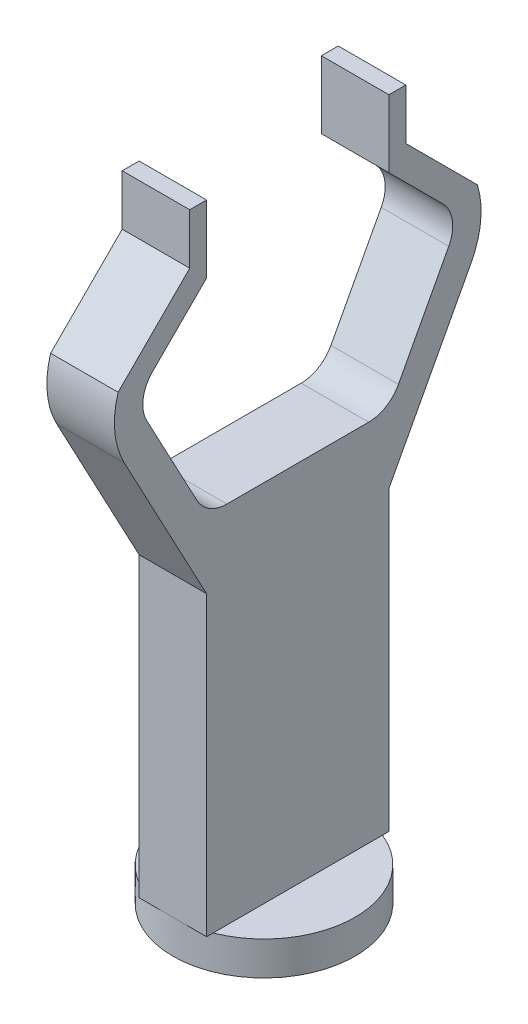
ISO-10303-21;
HEADER;
FILE_DESCRIPTION(('STEP AP214'),'2;1');
FILE_NAME('part.step','',(''),(''),'','','');
FILE_SCHEMA(('AUTOMOTIVE_DESIGN { 1 0 10303 214 1 1 1 1 }'));
ENDSEC;
DATA;
#1=APPLICATION_CONTEXT('core data for automotive mechanical design processes');
#2=APPLICATION_PROTOCOL_DEFINITION('international standard','automotive_design',2000,#1);
#3=PRODUCT_CONTEXT('',#1,'mechanical');
#4=PRODUCT('Part','Part','',(#3));
#5=PRODUCT_RELATED_PRODUCT_CATEGORY('part','',(#4));
#6=PRODUCT_DEFINITION_FORMATION('','',#4);
#7=PRODUCT_DEFINITION_CONTEXT('part definition',#1,'design');
#8=PRODUCT_DEFINITION('design','',#6,#7);
#9=PRODUCT_DEFINITION_SHAPE('','',#8);
#10=(LENGTH_UNIT() NAMED_UNIT(*) SI_UNIT(.MILLI.,.METRE.));
#11=(NAMED_UNIT(*) PLANE_ANGLE_UNIT() SI_UNIT($,.RADIAN.));
#12=(NAMED_UNIT(*) SI_UNIT($,.STERADIAN.) SOLID_ANGLE_UNIT());
#13=UNCERTAINTY_MEASURE_WITH_UNIT(LENGTH_MEASURE(1.E-05),#10,'distance_accuracy_value','');
#14=(GEOMETRIC_REPRESENTATION_CONTEXT(3) GLOBAL_UNCERTAINTY_ASSIGNED_CONTEXT((#13)) GLOBAL_UNIT_ASSIGNED_CONTEXT((#10,
#11,#12)) REPRESENTATION_CONTEXT('',''));
#15=CARTESIAN_POINT('',(0.,0.,0.));
#16=DIRECTION('',(0.,0.,1.));
#17=DIRECTION('',(1.,0.,0.));
#18=AXIS2_PLACEMENT_3D('',#15,#16,#17);
#19=CARTESIAN_POINT('',(0.,10.,0.));
#20=DIRECTION('',(0.,1.,0.));
#21=DIRECTION('',(0.,0.,1.));
#22=AXIS2_PLACEMENT_3D('',#19,#20,#21);
#23=PLANE('',#22);
#24=CARTESIAN_POINT('',(0.,10.,0.));
#25=DIRECTION('',(0.,1.,0.));
#26=DIRECTION('',(0.,0.,1.));
#27=AXIS2_PLACEMENT_3D('',#24,#25,#26);
#28=CIRCLE('',#27,27.);
#29=CARTESIAN_POINT('',(-10.,10.,-25.0798724079689));
#30=VERTEX_POINT('',#29);
#31=CARTESIAN_POINT('',(-10.,10.,25.0798724079689));
#32=VERTEX_POINT('',#31);
#33=EDGE_CURVE('E517',#30,#32,#28,.T.);
#34=ORIENTED_EDGE('',*,*,#33,.T.);
#35=DIRECTION('',(0.,0.,-1.));
#36=VECTOR('',#35,1.);
#37=CARTESIAN_POINT('',(-10.,10.,-27.));
#38=LINE('',#37,#36);
#39=EDGE_CURVE('E253',#32,#30,#38,.T.);
#40=ORIENTED_EDGE('',*,*,#39,.T.);
#41=EDGE_LOOP('',(#34,#40));
#42=FACE_BOUND('',#41,.T.);
#43=ADVANCED_FACE('F33',(#42),#23,.T.);
#44=CARTESIAN_POINT('',(0.,10.,0.));
#45=DIRECTION('',(0.,-1.,0.));
#46=DIRECTION('',(0.,0.,-1.));
#47=AXIS2_PLACEMENT_3D('',#44,#45,#46);
#48=CYLINDRICAL_SURFACE('',#47,27.);
#49=CARTESIAN_POINT('',(0.,10.,27.));
#50=VERTEX_POINT('',#49);
#51=CARTESIAN_POINT('',(10.,10.,25.0798724079689));
#52=VERTEX_POINT('',#51);
#53=EDGE_CURVE('E245',#50,#52,#28,.T.);
#54=ORIENTED_EDGE('',*,*,#53,.F.);
#55=EDGE_CURVE('E239',#32,#50,#28,.T.);
#56=ORIENTED_EDGE('',*,*,#55,.F.);
#57=ORIENTED_EDGE('',*,*,#33,.F.);
#58=CARTESIAN_POINT('',(0.,10.,-27.));
#59=VERTEX_POINT('',#58);
#60=EDGE_CURVE('E518',#59,#30,#28,.T.);
#61=ORIENTED_EDGE('',*,*,#60,.F.);
#62=CARTESIAN_POINT('',(10.,10.,-25.0798724079689));
#63=VERTEX_POINT('',#62);
#64=EDGE_CURVE('E501',#63,#59,#28,.T.);
#65=ORIENTED_EDGE('',*,*,#64,.F.);
#66=EDGE_CURVE('E248',#52,#63,#28,.T.);
#67=ORIENTED_EDGE('',*,*,#66,.F.);
#68=EDGE_LOOP('',(#54,#56,#57,#61,#65,#67));
#69=FACE_BOUND('',#68,.T.);
#70=CARTESIAN_POINT('',(0.,0.,0.));
#71=DIRECTION('',(0.,1.,0.));
#72=DIRECTION('',(0.,0.,1.));
#73=AXIS2_PLACEMENT_3D('',#70,#71,#72);
#74=CIRCLE('',#73,27.);
#75=CARTESIAN_POINT('',(0.,0.,27.));
#76=VERTEX_POINT('',#75);
#77=EDGE_CURVE('E236',#76,#76,#74,.T.);
#78=ORIENTED_EDGE('',*,*,#77,.T.);
#79=EDGE_LOOP('',(#78));
#80=FACE_BOUND('',#79,.T.);
#81=ADVANCED_FACE('F476',(#69,#80),#48,.T.);
#82=DIRECTION('',(0.,0.,-1.));
#83=VECTOR('',#82,1.);
#84=CARTESIAN_POINT('',(10.,10.,-27.));
#85=LINE('',#84,#83);
#86=EDGE_CURVE('E247',#52,#63,#85,.T.);
#87=ORIENTED_EDGE('',*,*,#86,.F.);
#88=ORIENTED_EDGE('',*,*,#66,.T.);
#89=EDGE_LOOP('',(#87,#88));
#90=FACE_BOUND('',#89,.T.);
#91=ADVANCED_FACE('F479',(#90),#23,.T.);
#92=CARTESIAN_POINT('',(0.,0.,0.));
#93=DIRECTION('',(0.,1.,0.));
#94=DIRECTION('',(0.,0.,1.));
#95=AXIS2_PLACEMENT_3D('',#92,#93,#94);
#96=PLANE('',#95);
#97=ORIENTED_EDGE('',*,*,#77,.F.);
#98=EDGE_LOOP('',(#97));
#99=FACE_BOUND('',#98,.T.);
#100=ADVANCED_FACE('F489',(#99),#96,.F.);
#101=CARTESIAN_POINT('',(10.,10.,-27.));
#102=DIRECTION('',(0.,1.,0.));
#103=DIRECTION('',(0.,0.,1.));
#104=AXIS2_PLACEMENT_3D('',#101,#102,#103);
#105=PLANE('',#104);
#106=CARTESIAN_POINT('',(10.,10.,-27.));
#107=VERTEX_POINT('',#106);
#108=EDGE_CURVE('E227',#63,#107,#85,.T.);
#109=ORIENTED_EDGE('',*,*,#108,.F.);
#110=ORIENTED_EDGE('',*,*,#64,.T.);
#111=DIRECTION('',(-1.,0.,0.));
#112=VECTOR('',#111,1.);
#113=CARTESIAN_POINT('',(10.,10.,-27.));
#114=LINE('',#113,#112);
#115=EDGE_CURVE('E366',#107,#59,#114,.T.);
#116=ORIENTED_EDGE('',*,*,#115,.F.);
#117=EDGE_LOOP('',(#109,#110,#116));
#118=FACE_BOUND('',#117,.T.);
#119=ADVANCED_FACE('F494',(#118),#105,.F.);
#120=CARTESIAN_POINT('',(-10.,10.,-27.));
#121=VERTEX_POINT('',#120);
#122=EDGE_CURVE('E325',#59,#121,#114,.T.);
#123=ORIENTED_EDGE('',*,*,#122,.F.);
#124=ORIENTED_EDGE('',*,*,#60,.T.);
#125=EDGE_CURVE('E363',#30,#121,#38,.T.);
#126=ORIENTED_EDGE('',*,*,#125,.T.);
#127=EDGE_LOOP('',(#123,#124,#126));
#128=FACE_BOUND('',#127,.T.);
#129=ADVANCED_FACE('F526',(#128),#105,.F.);
#130=DIRECTION('',(-1.,0.,0.));
#131=VECTOR('',#130,1.);
#132=CARTESIAN_POINT('',(10.,10.,27.));
#133=LINE('',#132,#131);
#134=CARTESIAN_POINT('',(10.,10.,27.));
#135=VERTEX_POINT('',#134);
#136=EDGE_CURVE('E369',#135,#50,#133,.T.);
#137=ORIENTED_EDGE('',*,*,#136,.T.);
#138=ORIENTED_EDGE('',*,*,#53,.T.);
#139=EDGE_CURVE('E322',#135,#52,#85,.T.);
#140=ORIENTED_EDGE('',*,*,#139,.F.);
#141=EDGE_LOOP('',(#137,#138,#140));
#142=FACE_BOUND('',#141,.T.);
#143=ADVANCED_FACE('F504',(#142),#105,.F.);
#144=CARTESIAN_POINT('',(-10.,10.,27.));
#145=VERTEX_POINT('',#144);
#146=EDGE_CURVE('E231',#145,#32,#38,.T.);
#147=ORIENTED_EDGE('',*,*,#146,.T.);
#148=ORIENTED_EDGE('',*,*,#55,.T.);
#149=EDGE_CURVE('E368',#50,#145,#133,.T.);
#150=ORIENTED_EDGE('',*,*,#149,.T.);
#151=EDGE_LOOP('',(#147,#148,#150));
#152=FACE_BOUND('',#151,.T.);
#153=ADVANCED_FACE('F515',(#152),#105,.F.);
#154=CARTESIAN_POINT('',(10.,10.,-27.));
#155=DIRECTION('',(0.,0.,1.));
#156=DIRECTION('',(1.,0.,0.));
#157=AXIS2_PLACEMENT_3D('',#154,#155,#156);
#158=PLANE('',#157);
#159=DIRECTION('',(0.,1.,0.));
#160=VECTOR('',#159,1.);
#161=CARTESIAN_POINT('',(-10.,10.,-27.));
#162=LINE('',#161,#160);
#163=CARTESIAN_POINT('',(-10.,98.,-27.));
#164=VERTEX_POINT('',#163);
#165=EDGE_CURVE('E235',#121,#164,#162,.T.);
#166=ORIENTED_EDGE('',*,*,#165,.T.);
#167=DIRECTION('',(-1.,0.,0.));
#168=VECTOR('',#167,1.);
#169=CARTESIAN_POINT('',(10.,98.,-27.));
#170=LINE('',#169,#168);
#171=CARTESIAN_POINT('',(10.,98.,-27.));
#172=VERTEX_POINT('',#171);
#173=EDGE_CURVE('E215',#172,#164,#170,.T.);
#174=ORIENTED_EDGE('',*,*,#173,.F.);
#175=DIRECTION('',(0.,1.,0.));
#176=VECTOR('',#175,1.);
#177=CARTESIAN_POINT('',(10.,10.,-27.));
#178=LINE('',#177,#176);
#179=EDGE_CURVE('E221',#107,#172,#178,.T.);
#180=ORIENTED_EDGE('',*,*,#179,.F.);
#181=ORIENTED_EDGE('',*,*,#115,.T.);
#182=ORIENTED_EDGE('',*,*,#122,.T.);
#183=EDGE_LOOP('',(#166,#174,#180,#181,#182));
#184=FACE_BOUND('',#183,.T.);
#185=ADVANCED_FACE('F233',(#184),#158,.F.);
#186=CARTESIAN_POINT('',(10.,98.,-27.));
#187=DIRECTION('',(0.,0.470477353221844,0.882412069333465));
#188=DIRECTION('',(0.,-0.882412069333465,0.470477353221844));
#189=AXIS2_PLACEMENT_3D('',#186,#187,#188);
#190=PLANE('',#189);
#191=DIRECTION('',(0.,0.882412069333465,-0.470477353221844));
#192=VECTOR('',#191,1.);
#193=CARTESIAN_POINT('',(-10.,98.,-27.));
#194=LINE('',#193,#192);
#195=CARTESIAN_POINT('',(-10.,143.705592111827,-51.3689391289177));
#196=VERTEX_POINT('',#195);
#197=EDGE_CURVE('E327',#164,#196,#194,.T.);
#198=ORIENTED_EDGE('',*,*,#197,.T.);
#199=DIRECTION('',(-1.,0.,0.));
#200=VECTOR('',#199,1.);
#201=CARTESIAN_POINT('',(10.,143.705592111827,-51.3689391289177));
#202=LINE('',#201,#200);
#203=CARTESIAN_POINT('',(10.,143.705592111827,-51.3689391289177));
#204=VERTEX_POINT('',#203);
#205=EDGE_CURVE('E218',#204,#196,#202,.T.);
#206=ORIENTED_EDGE('',*,*,#205,.F.);
#207=DIRECTION('',(0.,0.882412069333465,-0.470477353221844));
#208=VECTOR('',#207,1.);
#209=CARTESIAN_POINT('',(10.,98.,-27.));
#210=LINE('',#209,#208);
#211=EDGE_CURVE('E211',#172,#204,#210,.T.);
#212=ORIENTED_EDGE('',*,*,#211,.F.);
#213=ORIENTED_EDGE('',*,*,#173,.T.);
#214=EDGE_LOOP('',(#198,#206,#212,#213));
#215=FACE_BOUND('',#214,.T.);
#216=ADVANCED_FACE('F213',(#215),#190,.F.);
#217=CARTESIAN_POINT('',(10.,155.467525942373,-29.308637395581));
#218=DIRECTION('',(-1.,0.,0.));
#219=DIRECTION('',(0.,0.,1.));
#220=AXIS2_PLACEMENT_3D('',#217,#218,#219);
#221=CYLINDRICAL_SURFACE('',#220,25.);
#222=CARTESIAN_POINT('',(-10.,155.467525942373,-29.308637395581));
#223=DIRECTION('',(1.,0.,0.));
#224=DIRECTION('',(0.,0.,-1.));
#225=AXIS2_PLACEMENT_3D('',#222,#223,#224);
#226=CIRCLE('',#225,25.);
#227=CARTESIAN_POINT('',(-10.,162.786796564404,-53.2132034355968));
#228=VERTEX_POINT('',#227);
#229=EDGE_CURVE('E329',#196,#228,#226,.T.);
#230=ORIENTED_EDGE('',*,*,#229,.T.);
#231=DIRECTION('',(-1.,0.,0.));
#232=VECTOR('',#231,1.);
#233=CARTESIAN_POINT('',(10.,162.786796564404,-53.2132034355968));
#234=LINE('',#233,#232);
#235=CARTESIAN_POINT('',(10.,162.786796564404,-53.2132034355968));
#236=VERTEX_POINT('',#235);
#237=EDGE_CURVE('E241',#236,#228,#234,.T.);
#238=ORIENTED_EDGE('',*,*,#237,.F.);
#239=CARTESIAN_POINT('',(10.,155.467525942373,-29.308637395581));
#240=DIRECTION('',(1.,0.,0.));
#241=DIRECTION('',(0.,0.,-1.));
#242=AXIS2_PLACEMENT_3D('',#239,#240,#241);
#243=CIRCLE('',#242,25.);
#244=EDGE_CURVE('E220',#204,#236,#243,.T.);
#245=ORIENTED_EDGE('',*,*,#244,.F.);
#246=ORIENTED_EDGE('',*,*,#205,.T.);
#247=EDGE_LOOP('',(#230,#238,#245,#246));
#248=FACE_BOUND('',#247,.T.);
#249=ADVANCED_FACE('F527',(#248),#221,.T.);
#250=CARTESIAN_POINT('',(10.,184.,-32.));
#251=DIRECTION('',(0.,-0.707106781186558,0.707106781186537));
#252=DIRECTION('',(0.,-0.707106781186537,-0.707106781186558));
#253=AXIS2_PLACEMENT_3D('',#250,#251,#252);
#254=PLANE('',#253);
#255=DIRECTION('',(0.,0.707106781186537,0.707106781186558));
#256=VECTOR('',#255,1.);
#257=CARTESIAN_POINT('',(-10.,184.,-32.));
#258=LINE('',#257,#256);
#259=CARTESIAN_POINT('',(-10.,184.,-32.));
#260=VERTEX_POINT('',#259);
#261=EDGE_CURVE('E331',#228,#260,#258,.T.);
#262=ORIENTED_EDGE('',*,*,#261,.T.);
#263=DIRECTION('',(-1.,0.,0.));
#264=VECTOR('',#263,1.);
#265=CARTESIAN_POINT('',(10.,184.,-32.));
#266=LINE('',#265,#264);
#267=CARTESIAN_POINT('',(10.,184.,-32.));
#268=VERTEX_POINT('',#267);
#269=EDGE_CURVE('E400',#268,#260,#266,.T.);
#270=ORIENTED_EDGE('',*,*,#269,.F.);
#271=DIRECTION('',(0.,0.707106781186537,0.707106781186558));
#272=VECTOR('',#271,1.);
#273=CARTESIAN_POINT('',(10.,184.,-32.));
#274=LINE('',#273,#272);
#275=EDGE_CURVE('E409',#236,#268,#274,.T.);
#276=ORIENTED_EDGE('',*,*,#275,.F.);
#277=ORIENTED_EDGE('',*,*,#237,.T.);
#278=EDGE_LOOP('',(#262,#270,#276,#277));
#279=FACE_BOUND('',#278,.T.);
#280=ADVANCED_FACE('F407',(#279),#254,.F.);
#281=CARTESIAN_POINT('',(10.,199.,-32.));
#282=DIRECTION('',(0.,0.,1.));
#283=DIRECTION('',(1.,0.,0.));
#284=AXIS2_PLACEMENT_3D('',#281,#282,#283);
#285=PLANE('',#284);
#286=DIRECTION('',(0.,1.,0.));
#287=VECTOR('',#286,1.);
#288=CARTESIAN_POINT('',(-10.,199.,-32.));
#289=LINE('',#288,#287);
#290=CARTESIAN_POINT('',(-10.,199.,-32.));
#291=VERTEX_POINT('',#290);
#292=EDGE_CURVE('E333',#260,#291,#289,.T.);
#293=ORIENTED_EDGE('',*,*,#292,.T.);
#294=DIRECTION('',(-1.,0.,0.));
#295=VECTOR('',#294,1.);
#296=CARTESIAN_POINT('',(10.,199.,-32.));
#297=LINE('',#296,#295);
#298=CARTESIAN_POINT('',(10.,199.,-32.));
#299=VERTEX_POINT('',#298);
#300=EDGE_CURVE('E397',#299,#291,#297,.T.);
#301=ORIENTED_EDGE('',*,*,#300,.F.);
#302=DIRECTION('',(0.,1.,0.));
#303=VECTOR('',#302,1.);
#304=CARTESIAN_POINT('',(10.,199.,-32.));
#305=LINE('',#304,#303);
#306=EDGE_CURVE('E426',#268,#299,#305,.T.);
#307=ORIENTED_EDGE('',*,*,#306,.F.);
#308=ORIENTED_EDGE('',*,*,#269,.T.);
#309=EDGE_LOOP('',(#293,#301,#307,#308));
#310=FACE_BOUND('',#309,.T.);
#311=ADVANCED_FACE('F417',(#310),#285,.F.);
#312=CARTESIAN_POINT('',(10.,199.,-27.));
#313=DIRECTION('',(0.,-1.,0.));
#314=DIRECTION('',(0.,0.,-1.));
#315=AXIS2_PLACEMENT_3D('',#312,#313,#314);
#316=PLANE('',#315);
#317=DIRECTION('',(0.,0.,1.));
#318=VECTOR('',#317,1.);
#319=CARTESIAN_POINT('',(-10.,199.,-27.));
#320=LINE('',#319,#318);
#321=CARTESIAN_POINT('',(-10.,199.,-27.));
#322=VERTEX_POINT('',#321);
#323=EDGE_CURVE('E335',#291,#322,#320,.T.);
#324=ORIENTED_EDGE('',*,*,#323,.T.);
#325=DIRECTION('',(-1.,0.,0.));
#326=VECTOR('',#325,1.);
#327=CARTESIAN_POINT('',(10.,199.,-27.));
#328=LINE('',#327,#326);
#329=CARTESIAN_POINT('',(10.,199.,-27.));
#330=VERTEX_POINT('',#329);
#331=EDGE_CURVE('E394',#330,#322,#328,.T.);
#332=ORIENTED_EDGE('',*,*,#331,.F.);
#333=DIRECTION('',(0.,0.,1.));
#334=VECTOR('',#333,1.);
#335=CARTESIAN_POINT('',(10.,199.,-27.));
#336=LINE('',#335,#334);
#337=EDGE_CURVE('E423',#299,#330,#336,.T.);
#338=ORIENTED_EDGE('',*,*,#337,.F.);
#339=ORIENTED_EDGE('',*,*,#300,.T.);
#340=EDGE_LOOP('',(#324,#332,#338,#339));
#341=FACE_BOUND('',#340,.T.);
#342=ADVANCED_FACE('F421',(#341),#316,.F.);
#343=CARTESIAN_POINT('',(10.,199.,-27.));
#344=DIRECTION('',(0.,0.,-1.));
#345=DIRECTION('',(-1.,0.,0.));
#346=AXIS2_PLACEMENT_3D('',#343,#344,#345);
#347=PLANE('',#346);
#348=DIRECTION('',(0.,-1.,0.));
#349=VECTOR('',#348,1.);
#350=CARTESIAN_POINT('',(-10.,199.,-27.));
#351=LINE('',#350,#349);
#352=CARTESIAN_POINT('',(-10.,179.,-27.));
#353=VERTEX_POINT('',#352);
#354=EDGE_CURVE('E337',#322,#353,#351,.T.);
#355=ORIENTED_EDGE('',*,*,#354,.T.);
#356=DIRECTION('',(-1.,0.,0.));
#357=VECTOR('',#356,1.);
#358=CARTESIAN_POINT('',(10.,179.,-27.));
#359=LINE('',#358,#357);
#360=CARTESIAN_POINT('',(10.,179.,-27.));
#361=VERTEX_POINT('',#360);
#362=EDGE_CURVE('E391',#361,#353,#359,.T.);
#363=ORIENTED_EDGE('',*,*,#362,.F.);
#364=DIRECTION('',(0.,-1.,0.));
#365=VECTOR('',#364,1.);
#366=CARTESIAN_POINT('',(10.,199.,-27.));
#367=LINE('',#366,#365);
#368=EDGE_CURVE('E425',#330,#361,#367,.T.);
#369=ORIENTED_EDGE('',*,*,#368,.F.);
#370=ORIENTED_EDGE('',*,*,#331,.T.);
#371=EDGE_LOOP('',(#355,#363,#369,#370));
#372=FACE_BOUND('',#371,.T.);
#373=ADVANCED_FACE('F466',(#372),#347,.F.);
#374=CARTESIAN_POINT('',(10.,179.,-27.));
#375=DIRECTION('',(0.,0.707106781186559,-0.707106781186536));
#376=DIRECTION('',(0.,0.707106781186536,0.707106781186559));
#377=AXIS2_PLACEMENT_3D('',#374,#375,#376);
#378=PLANE('',#377);
#379=DIRECTION('',(0.,-0.707106781186536,-0.707106781186559));
#380=VECTOR('',#379,1.);
#381=CARTESIAN_POINT('',(-10.,179.,-27.));
#382=LINE('',#381,#380);
#383=CARTESIAN_POINT('',(-10.,163.025348636847,-42.9746513631537));
#384=VERTEX_POINT('',#383);
#385=EDGE_CURVE('E339',#353,#384,#382,.T.);
#386=ORIENTED_EDGE('',*,*,#385,.T.);
#387=DIRECTION('',(-1.,0.,0.));
#388=VECTOR('',#387,1.);
#389=CARTESIAN_POINT('',(10.,163.025348636847,-42.9746513631537));
#390=LINE('',#389,#388);
#391=CARTESIAN_POINT('',(10.,163.025348636847,-42.9746513631537));
#392=VERTEX_POINT('',#391);
#393=EDGE_CURVE('E266',#384,#392,#390,.F.);
#394=ORIENTED_EDGE('',*,*,#393,.T.);
#395=DIRECTION('',(0.,-0.707106781186536,-0.707106781186559));
#396=VECTOR('',#395,1.);
#397=CARTESIAN_POINT('',(10.,179.,-27.));
#398=LINE('',#397,#396);
#399=EDGE_CURVE('E428',#361,#392,#398,.T.);
#400=ORIENTED_EDGE('',*,*,#399,.F.);
#401=ORIENTED_EDGE('',*,*,#362,.T.);
#402=EDGE_LOOP('',(#386,#394,#400,#401));
#403=FACE_BOUND('',#402,.T.);
#404=ADVANCED_FACE('F462',(#403),#378,.F.);
#405=CARTESIAN_POINT('',(10.,157.786796564404,-48.2132034355968));
#406=DIRECTION('',(0.,-0.470477353221844,-0.882412069333465));
#407=DIRECTION('',(0.,0.882412069333465,-0.470477353221844));
#408=AXIS2_PLACEMENT_3D('',#405,#406,#407);
#409=PLANE('',#408);
#410=DIRECTION('',(0.,-0.882412069333465,0.470477353221844));
#411=VECTOR('',#410,1.);
#412=CARTESIAN_POINT('',(-10.,157.786796564404,-48.2132034355968));
#413=LINE('',#412,#411);
#414=CARTESIAN_POINT('',(-10.,151.249507292763,-44.727704244623));
#415=VERTEX_POINT('',#414);
#416=CARTESIAN_POINT('',(-10.,123.295226467782,-29.8232661585804));
#417=VERTEX_POINT('',#416);
#418=EDGE_CURVE('E342',#415,#417,#413,.T.);
#419=ORIENTED_EDGE('',*,*,#418,.T.);
#420=DIRECTION('',(-1.,0.,0.));
#421=VECTOR('',#420,1.);
#422=CARTESIAN_POINT('',(10.,123.295226467782,-29.8232661585804));
#423=LINE('',#422,#421);
#424=CARTESIAN_POINT('',(10.,123.295226467782,-29.8232661585804));
#425=VERTEX_POINT('',#424);
#426=EDGE_CURVE('E259',#417,#425,#423,.F.);
#427=ORIENTED_EDGE('',*,*,#426,.T.);
#428=DIRECTION('',(0.,-0.882412069333465,0.470477353221844));
#429=VECTOR('',#428,1.);
#430=CARTESIAN_POINT('',(10.,157.786796564404,-48.2132034355968));
#431=LINE('',#430,#429);
#432=CARTESIAN_POINT('',(10.,151.249507292763,-44.727704244623));
#433=VERTEX_POINT('',#432);
#434=EDGE_CURVE('E435',#433,#425,#431,.T.);
#435=ORIENTED_EDGE('',*,*,#434,.F.);
#436=DIRECTION('',(-1.,0.,0.));
#437=VECTOR('',#436,1.);
#438=CARTESIAN_POINT('',(-9.99999999999999,151.249507292763,-44.727704244623));
#439=LINE('',#438,#437);
#440=EDGE_CURVE('E256',#433,#415,#439,.T.);
#441=ORIENTED_EDGE('',*,*,#440,.T.);
#442=EDGE_LOOP('',(#419,#427,#435,#441));
#443=FACE_BOUND('',#442,.T.);
#444=ADVANCED_FACE('F453',(#443),#409,.F.);
#445=CARTESIAN_POINT('',(10.,118.,-27.));
#446=DIRECTION('',(0.,-1.,0.));
#447=DIRECTION('',(0.,0.,-1.));
#448=AXIS2_PLACEMENT_3D('',#445,#446,#447);
#449=PLANE('',#448);
#450=DIRECTION('',(0.,0.,1.));
#451=VECTOR('',#450,1.);
#452=CARTESIAN_POINT('',(10.,118.,-27.));
#453=LINE('',#452,#451);
#454=CARTESIAN_POINT('',(10.,118.,-20.9991454652458));
#455=VERTEX_POINT('',#454);
#456=CARTESIAN_POINT('',(10.,118.,20.9991454652458));
#457=VERTEX_POINT('',#456);
#458=EDGE_CURVE('E307',#455,#457,#453,.T.);
#459=ORIENTED_EDGE('',*,*,#458,.F.);
#460=DIRECTION('',(-1.,0.,0.));
#461=VECTOR('',#460,1.);
#462=CARTESIAN_POINT('',(-9.99999999999999,118.,-20.9991454652458));
#463=LINE('',#462,#461);
#464=CARTESIAN_POINT('',(-10.,118.,-20.9991454652458));
#465=VERTEX_POINT('',#464);
#466=EDGE_CURVE('E252',#455,#465,#463,.T.);
#467=ORIENTED_EDGE('',*,*,#466,.T.);
#468=DIRECTION('',(0.,0.,1.));
#469=VECTOR('',#468,1.);
#470=CARTESIAN_POINT('',(-10.,118.,-27.));
#471=LINE('',#470,#469);
#472=CARTESIAN_POINT('',(-10.,118.,20.9991454652458));
#473=VERTEX_POINT('',#472);
#474=EDGE_CURVE('E293',#465,#473,#471,.T.);
#475=ORIENTED_EDGE('',*,*,#474,.T.);
#476=DIRECTION('',(-1.,0.,0.));
#477=VECTOR('',#476,1.);
#478=CARTESIAN_POINT('',(10.,118.,20.9991454652458));
#479=LINE('',#478,#477);
#480=EDGE_CURVE('E250',#473,#457,#479,.F.);
#481=ORIENTED_EDGE('',*,*,#480,.T.);
#482=EDGE_LOOP('',(#459,#467,#475,#481));
#483=FACE_BOUND('',#482,.T.);
#484=ADVANCED_FACE('F447',(#483),#449,.F.);
#485=CARTESIAN_POINT('',(10.,157.786796564404,48.2132034355968));
#486=DIRECTION('',(0.,-0.470477353221844,0.882412069333465));
#487=DIRECTION('',(0.,-0.882412069333465,-0.470477353221844));
#488=AXIS2_PLACEMENT_3D('',#485,#486,#487);
#489=PLANE('',#488);
#490=DIRECTION('',(0.,0.882412069333465,0.470477353221844));
#491=VECTOR('',#490,1.);
#492=CARTESIAN_POINT('',(10.,157.786796564404,48.2132034355968));
#493=LINE('',#492,#491);
#494=CARTESIAN_POINT('',(10.,123.295226467782,29.8232661585804));
#495=VERTEX_POINT('',#494);
#496=CARTESIAN_POINT('',(10.,151.249507292763,44.727704244623));
#497=VERTEX_POINT('',#496);
#498=EDGE_CURVE('E303',#495,#497,#493,.T.);
#499=ORIENTED_EDGE('',*,*,#498,.F.);
#500=DIRECTION('',(-1.,0.,0.));
#501=VECTOR('',#500,1.);
#502=CARTESIAN_POINT('',(-9.99999999999999,123.295226467782,29.8232661585804));
#503=LINE('',#502,#501);
#504=CARTESIAN_POINT('',(-10.,123.295226467782,29.8232661585804));
#505=VERTEX_POINT('',#504);
#506=EDGE_CURVE('E263',#495,#505,#503,.T.);
#507=ORIENTED_EDGE('',*,*,#506,.T.);
#508=DIRECTION('',(0.,0.882412069333465,0.470477353221844));
#509=VECTOR('',#508,1.);
#510=CARTESIAN_POINT('',(-10.,157.786796564404,48.2132034355968));
#511=LINE('',#510,#509);
#512=CARTESIAN_POINT('',(-10.,151.249507292763,44.727704244623));
#513=VERTEX_POINT('',#512);
#514=EDGE_CURVE('E286',#505,#513,#511,.T.);
#515=ORIENTED_EDGE('',*,*,#514,.T.);
#516=DIRECTION('',(-1.,0.,0.));
#517=VECTOR('',#516,1.);
#518=CARTESIAN_POINT('',(10.,151.249507292763,44.727704244623));
#519=LINE('',#518,#517);
#520=EDGE_CURVE('E261',#513,#497,#519,.F.);
#521=ORIENTED_EDGE('',*,*,#520,.T.);
#522=EDGE_LOOP('',(#499,#507,#515,#521));
#523=FACE_BOUND('',#522,.T.);
#524=ADVANCED_FACE('F291',(#523),#489,.F.);
#525=CARTESIAN_POINT('',(10.,179.,27.));
#526=DIRECTION('',(0.,0.707106781186559,0.707106781186536));
#527=DIRECTION('',(0.,-0.707106781186536,0.707106781186559));
#528=AXIS2_PLACEMENT_3D('',#525,#526,#527);
#529=PLANE('',#528);
#530=DIRECTION('',(0.,0.707106781186536,-0.707106781186559));
#531=VECTOR('',#530,1.);
#532=CARTESIAN_POINT('',(10.,179.,27.));
#533=LINE('',#532,#531);
#534=CARTESIAN_POINT('',(10.,163.025348636847,42.9746513631537));
#535=VERTEX_POINT('',#534);
#536=CARTESIAN_POINT('',(10.,179.,27.));
#537=VERTEX_POINT('',#536);
#538=EDGE_CURVE('E299',#535,#537,#533,.T.);
#539=ORIENTED_EDGE('',*,*,#538,.F.);
#540=DIRECTION('',(-1.,0.,0.));
#541=VECTOR('',#540,1.);
#542=CARTESIAN_POINT('',(-9.99999999999999,163.025348636847,42.9746513631537));
#543=LINE('',#542,#541);
#544=CARTESIAN_POINT('',(-10.,163.025348636847,42.9746513631537));
#545=VERTEX_POINT('',#544);
#546=EDGE_CURVE('E268',#535,#545,#543,.T.);
#547=ORIENTED_EDGE('',*,*,#546,.T.);
#548=DIRECTION('',(0.,0.707106781186536,-0.707106781186559));
#549=VECTOR('',#548,1.);
#550=CARTESIAN_POINT('',(-10.,179.,27.));
#551=LINE('',#550,#549);
#552=CARTESIAN_POINT('',(-10.,179.,27.));
#553=VERTEX_POINT('',#552);
#554=EDGE_CURVE('E288',#545,#553,#551,.T.);
#555=ORIENTED_EDGE('',*,*,#554,.T.);
#556=DIRECTION('',(-1.,0.,0.));
#557=VECTOR('',#556,1.);
#558=CARTESIAN_POINT('',(10.,179.,27.));
#559=LINE('',#558,#557);
#560=EDGE_CURVE('E300',#537,#553,#559,.T.);
#561=ORIENTED_EDGE('',*,*,#560,.F.);
#562=EDGE_LOOP('',(#539,#547,#555,#561));
#563=FACE_BOUND('',#562,.T.);
#564=ADVANCED_FACE('F296',(#563),#529,.F.);
#565=CARTESIAN_POINT('',(10.,199.,27.));
#566=DIRECTION('',(0.,0.,1.));
#567=DIRECTION('',(1.,0.,0.));
#568=AXIS2_PLACEMENT_3D('',#565,#566,#567);
#569=PLANE('',#568);
#570=DIRECTION('',(0.,1.,0.));
#571=VECTOR('',#570,1.);
#572=CARTESIAN_POINT('',(-10.,199.,27.));
#573=LINE('',#572,#571);
#574=CARTESIAN_POINT('',(-10.,199.,27.));
#575=VERTEX_POINT('',#574);
#576=EDGE_CURVE('E348',#553,#575,#573,.T.);
#577=ORIENTED_EDGE('',*,*,#576,.T.);
#578=DIRECTION('',(-1.,0.,0.));
#579=VECTOR('',#578,1.);
#580=CARTESIAN_POINT('',(10.,199.,27.));
#581=LINE('',#580,#579);
#582=CARTESIAN_POINT('',(10.,199.,27.));
#583=VERTEX_POINT('',#582);
#584=EDGE_CURVE('E387',#583,#575,#581,.T.);
#585=ORIENTED_EDGE('',*,*,#584,.F.);
#586=DIRECTION('',(0.,1.,0.));
#587=VECTOR('',#586,1.);
#588=CARTESIAN_POINT('',(10.,199.,27.));
#589=LINE('',#588,#587);
#590=EDGE_CURVE('E302',#537,#583,#589,.T.);
#591=ORIENTED_EDGE('',*,*,#590,.F.);
#592=ORIENTED_EDGE('',*,*,#560,.T.);
#593=EDGE_LOOP('',(#577,#585,#591,#592));
#594=FACE_BOUND('',#593,.T.);
#595=ADVANCED_FACE('F605',(#594),#569,.F.);
#596=CARTESIAN_POINT('',(10.,199.,27.));
#597=DIRECTION('',(0.,-1.,0.));
#598=DIRECTION('',(0.,0.,-1.));
#599=AXIS2_PLACEMENT_3D('',#596,#597,#598);
#600=PLANE('',#599);
#601=DIRECTION('',(0.,0.,1.));
#602=VECTOR('',#601,1.);
#603=CARTESIAN_POINT('',(-10.,199.,27.));
#604=LINE('',#603,#602);
#605=CARTESIAN_POINT('',(-10.,199.,32.));
#606=VERTEX_POINT('',#605);
#607=EDGE_CURVE('E350',#575,#606,#604,.T.);
#608=ORIENTED_EDGE('',*,*,#607,.T.);
#609=DIRECTION('',(-1.,0.,0.));
#610=VECTOR('',#609,1.);
#611=CARTESIAN_POINT('',(10.,199.,32.));
#612=LINE('',#611,#610);
#613=CARTESIAN_POINT('',(10.,199.,32.));
#614=VERTEX_POINT('',#613);
#615=EDGE_CURVE('E384',#614,#606,#612,.T.);
#616=ORIENTED_EDGE('',*,*,#615,.F.);
#617=DIRECTION('',(0.,0.,1.));
#618=VECTOR('',#617,1.);
#619=CARTESIAN_POINT('',(10.,199.,27.));
#620=LINE('',#619,#618);
#621=EDGE_CURVE('E305',#583,#614,#620,.T.);
#622=ORIENTED_EDGE('',*,*,#621,.F.);
#623=ORIENTED_EDGE('',*,*,#584,.T.);
#624=EDGE_LOOP('',(#608,#616,#622,#623));
#625=FACE_BOUND('',#624,.T.);
#626=ADVANCED_FACE('F610',(#625),#600,.F.);
#627=CARTESIAN_POINT('',(10.,199.,32.));
#628=DIRECTION('',(0.,0.,-1.));
#629=DIRECTION('',(-1.,0.,0.));
#630=AXIS2_PLACEMENT_3D('',#627,#628,#629);
#631=PLANE('',#630);
#632=DIRECTION('',(0.,-1.,0.));
#633=VECTOR('',#632,1.);
#634=CARTESIAN_POINT('',(-10.,199.,32.));
#635=LINE('',#634,#633);
#636=CARTESIAN_POINT('',(-10.,184.,32.));
#637=VERTEX_POINT('',#636);
#638=EDGE_CURVE('E352',#606,#637,#635,.T.);
#639=ORIENTED_EDGE('',*,*,#638,.T.);
#640=DIRECTION('',(-1.,0.,0.));
#641=VECTOR('',#640,1.);
#642=CARTESIAN_POINT('',(10.,184.,32.));
#643=LINE('',#642,#641);
#644=CARTESIAN_POINT('',(10.,184.,32.));
#645=VERTEX_POINT('',#644);
#646=EDGE_CURVE('E381',#645,#637,#643,.T.);
#647=ORIENTED_EDGE('',*,*,#646,.F.);
#648=DIRECTION('',(0.,-1.,0.));
#649=VECTOR('',#648,1.);
#650=CARTESIAN_POINT('',(10.,199.,32.));
#651=LINE('',#650,#649);
#652=EDGE_CURVE('E312',#614,#645,#651,.T.);
#653=ORIENTED_EDGE('',*,*,#652,.F.);
#654=ORIENTED_EDGE('',*,*,#615,.T.);
#655=EDGE_LOOP('',(#639,#647,#653,#654));
#656=FACE_BOUND('',#655,.T.);
#657=ADVANCED_FACE('F622',(#656),#631,.F.);
#658=CARTESIAN_POINT('',(10.,184.,32.));
#659=DIRECTION('',(0.,-0.707106781186558,-0.707106781186537));
#660=DIRECTION('',(0.,0.707106781186537,-0.707106781186558));
#661=AXIS2_PLACEMENT_3D('',#658,#659,#660);
#662=PLANE('',#661);
#663=DIRECTION('',(0.,-0.707106781186537,0.707106781186558));
#664=VECTOR('',#663,1.);
#665=CARTESIAN_POINT('',(-10.,184.,32.));
#666=LINE('',#665,#664);
#667=CARTESIAN_POINT('',(-10.,162.786796564404,53.2132034355967));
#668=VERTEX_POINT('',#667);
#669=EDGE_CURVE('E354',#637,#668,#666,.T.);
#670=ORIENTED_EDGE('',*,*,#669,.T.);
#671=DIRECTION('',(-1.,0.,0.));
#672=VECTOR('',#671,1.);
#673=CARTESIAN_POINT('',(10.,162.786796564404,53.2132034355967));
#674=LINE('',#673,#672);
#675=CARTESIAN_POINT('',(10.,162.786796564404,53.2132034355967));
#676=VERTEX_POINT('',#675);
#677=EDGE_CURVE('E378',#676,#668,#674,.T.);
#678=ORIENTED_EDGE('',*,*,#677,.F.);
#679=DIRECTION('',(0.,-0.707106781186537,0.707106781186558));
#680=VECTOR('',#679,1.);
#681=CARTESIAN_POINT('',(10.,184.,32.));
#682=LINE('',#681,#680);
#683=EDGE_CURVE('E314',#645,#676,#682,.T.);
#684=ORIENTED_EDGE('',*,*,#683,.F.);
#685=ORIENTED_EDGE('',*,*,#646,.T.);
#686=EDGE_LOOP('',(#670,#678,#684,#685));
#687=FACE_BOUND('',#686,.T.);
#688=ADVANCED_FACE('F632',(#687),#662,.F.);
#689=CARTESIAN_POINT('',(10.,155.467525942373,29.308637395581));
#690=DIRECTION('',(-1.,0.,0.));
#691=DIRECTION('',(0.,0.,1.));
#692=AXIS2_PLACEMENT_3D('',#689,#690,#691);
#693=CYLINDRICAL_SURFACE('',#692,25.);
#694=CARTESIAN_POINT('',(-10.,155.467525942373,29.308637395581));
#695=DIRECTION('',(1.,0.,0.));
#696=DIRECTION('',(0.,0.,1.));
#697=AXIS2_PLACEMENT_3D('',#694,#695,#696);
#698=CIRCLE('',#697,25.);
#699=CARTESIAN_POINT('',(-10.,143.705592111827,51.3689391289176));
#700=VERTEX_POINT('',#699);
#701=EDGE_CURVE('E356',#668,#700,#698,.T.);
#702=ORIENTED_EDGE('',*,*,#701,.T.);
#703=DIRECTION('',(-1.,0.,0.));
#704=VECTOR('',#703,1.);
#705=CARTESIAN_POINT('',(10.,143.705592111827,51.3689391289176));
#706=LINE('',#705,#704);
#707=CARTESIAN_POINT('',(10.,143.705592111827,51.3689391289176));
#708=VERTEX_POINT('',#707);
#709=EDGE_CURVE('E375',#708,#700,#706,.T.);
#710=ORIENTED_EDGE('',*,*,#709,.F.);
#711=CARTESIAN_POINT('',(10.,155.467525942373,29.308637395581));
#712=DIRECTION('',(1.,0.,0.));
#713=DIRECTION('',(0.,0.,1.));
#714=AXIS2_PLACEMENT_3D('',#711,#712,#713);
#715=CIRCLE('',#714,25.);
#716=EDGE_CURVE('E316',#676,#708,#715,.T.);
#717=ORIENTED_EDGE('',*,*,#716,.F.);
#718=ORIENTED_EDGE('',*,*,#677,.T.);
#719=EDGE_LOOP('',(#702,#710,#717,#718));
#720=FACE_BOUND('',#719,.T.);
#721=ADVANCED_FACE('F642',(#720),#693,.T.);
#722=CARTESIAN_POINT('',(10.,98.,27.));
#723=DIRECTION('',(0.,0.470477353221844,-0.882412069333465));
#724=DIRECTION('',(0.,0.882412069333465,0.470477353221844));
#725=AXIS2_PLACEMENT_3D('',#722,#723,#724);
#726=PLANE('',#725);
#727=DIRECTION('',(0.,-0.882412069333465,-0.470477353221844));
#728=VECTOR('',#727,1.);
#729=CARTESIAN_POINT('',(-10.,98.,27.));
#730=LINE('',#729,#728);
#731=CARTESIAN_POINT('',(-10.,98.,27.));
#732=VERTEX_POINT('',#731);
#733=EDGE_CURVE('E358',#700,#732,#730,.T.);
#734=ORIENTED_EDGE('',*,*,#733,.T.);
#735=DIRECTION('',(-1.,0.,0.));
#736=VECTOR('',#735,1.);
#737=CARTESIAN_POINT('',(10.,98.,27.));
#738=LINE('',#737,#736);
#739=CARTESIAN_POINT('',(10.,98.,27.));
#740=VERTEX_POINT('',#739);
#741=EDGE_CURVE('E372',#740,#732,#738,.T.);
#742=ORIENTED_EDGE('',*,*,#741,.F.);
#743=DIRECTION('',(0.,-0.882412069333465,-0.470477353221844));
#744=VECTOR('',#743,1.);
#745=CARTESIAN_POINT('',(10.,98.,27.));
#746=LINE('',#745,#744);
#747=EDGE_CURVE('E318',#708,#740,#746,.T.);
#748=ORIENTED_EDGE('',*,*,#747,.F.);
#749=ORIENTED_EDGE('',*,*,#709,.T.);
#750=EDGE_LOOP('',(#734,#742,#748,#749));
#751=FACE_BOUND('',#750,.T.);
#752=ADVANCED_FACE('F652',(#751),#726,.F.);
#753=CARTESIAN_POINT('',(10.,10.,27.));
#754=DIRECTION('',(0.,0.,-1.));
#755=DIRECTION('',(-1.,0.,0.));
#756=AXIS2_PLACEMENT_3D('',#753,#754,#755);
#757=PLANE('',#756);
#758=DIRECTION('',(0.,-1.,0.));
#759=VECTOR('',#758,1.);
#760=CARTESIAN_POINT('',(-10.,10.,27.));
#761=LINE('',#760,#759);
#762=EDGE_CURVE('E360',#732,#145,#761,.T.);
#763=ORIENTED_EDGE('',*,*,#762,.T.);
#764=ORIENTED_EDGE('',*,*,#149,.F.);
#765=ORIENTED_EDGE('',*,*,#136,.F.);
#766=DIRECTION('',(0.,-1.,0.));
#767=VECTOR('',#766,1.);
#768=CARTESIAN_POINT('',(10.,10.,27.));
#769=LINE('',#768,#767);
#770=EDGE_CURVE('E320',#740,#135,#769,.T.);
#771=ORIENTED_EDGE('',*,*,#770,.F.);
#772=ORIENTED_EDGE('',*,*,#741,.T.);
#773=EDGE_LOOP('',(#763,#764,#765,#771,#772));
#774=FACE_BOUND('',#773,.T.);
#775=ADVANCED_FACE('F511',(#774),#757,.F.);
#776=CARTESIAN_POINT('',(10.,155.467525942373,-29.308637395581));
#777=DIRECTION('',(1.,0.,0.));
#778=DIRECTION('',(0.,0.,-1.));
#779=AXIS2_PLACEMENT_3D('',#776,#777,#778);
#780=PLANE('',#779);
#781=ORIENTED_EDGE('',*,*,#179,.T.);
#782=ORIENTED_EDGE('',*,*,#211,.T.);
#783=ORIENTED_EDGE('',*,*,#244,.T.);
#784=ORIENTED_EDGE('',*,*,#275,.T.);
#785=ORIENTED_EDGE('',*,*,#306,.T.);
#786=ORIENTED_EDGE('',*,*,#337,.T.);
#787=ORIENTED_EDGE('',*,*,#368,.T.);
#788=ORIENTED_EDGE('',*,*,#399,.T.);
#789=CARTESIAN_POINT('',(10.,155.954280824981,-35.9035835512883));
#790=DIRECTION('',(1.,0.,0.));
#791=DIRECTION('',(0.,0.,-1.));
#792=AXIS2_PLACEMENT_3D('',#789,#790,#791);
#793=CIRCLE('',#792,10.);
#794=EDGE_CURVE('E280',#392,#433,#793,.F.);
#795=ORIENTED_EDGE('',*,*,#794,.T.);
#796=ORIENTED_EDGE('',*,*,#434,.T.);
#797=CARTESIAN_POINT('',(10.,128.,-20.9991454652458));
#798=DIRECTION('',(1.,0.,0.));
#799=DIRECTION('',(0.,0.,-1.));
#800=AXIS2_PLACEMENT_3D('',#797,#798,#799);
#801=CIRCLE('',#800,10.);
#802=EDGE_CURVE('E272',#425,#455,#801,.F.);
#803=ORIENTED_EDGE('',*,*,#802,.T.);
#804=ORIENTED_EDGE('',*,*,#458,.T.);
#805=CARTESIAN_POINT('',(10.,128.,20.9991454652458));
#806=DIRECTION('',(1.,0.,0.));
#807=DIRECTION('',(0.,0.,-1.));
#808=AXIS2_PLACEMENT_3D('',#805,#806,#807);
#809=CIRCLE('',#808,10.);
#810=EDGE_CURVE('E276',#457,#495,#809,.F.);
#811=ORIENTED_EDGE('',*,*,#810,.T.);
#812=ORIENTED_EDGE('',*,*,#498,.T.);
#813=CARTESIAN_POINT('',(10.,155.954280824981,35.9035835512883));
#814=DIRECTION('',(1.,0.,0.));
#815=DIRECTION('',(0.,0.,-1.));
#816=AXIS2_PLACEMENT_3D('',#813,#814,#815);
#817=CIRCLE('',#816,10.);
#818=EDGE_CURVE('E11',#497,#535,#817,.F.);
#819=ORIENTED_EDGE('',*,*,#818,.T.);
#820=ORIENTED_EDGE('',*,*,#538,.T.);
#821=ORIENTED_EDGE('',*,*,#590,.T.);
#822=ORIENTED_EDGE('',*,*,#621,.T.);
#823=ORIENTED_EDGE('',*,*,#652,.T.);
#824=ORIENTED_EDGE('',*,*,#683,.T.);
#825=ORIENTED_EDGE('',*,*,#716,.T.);
#826=ORIENTED_EDGE('',*,*,#747,.T.);
#827=ORIENTED_EDGE('',*,*,#770,.T.);
#828=ORIENTED_EDGE('',*,*,#139,.T.);
#829=ORIENTED_EDGE('',*,*,#86,.T.);
#830=ORIENTED_EDGE('',*,*,#108,.T.);
#831=EDGE_LOOP('',(#781,#782,#783,#784,#785,#786,#787,#788,#795,#796,#803,#804,#811,#812,#819,
#820,#821,#822,#823,#824,#825,#826,#827,#828,#829,#830));
#832=FACE_BOUND('',#831,.T.);
#833=ADVANCED_FACE('F224',(#832),#780,.T.);
#834=CARTESIAN_POINT('',(-10.,155.467525942373,-29.308637395581));
#835=DIRECTION('',(1.,0.,0.));
#836=DIRECTION('',(0.,0.,-1.));
#837=AXIS2_PLACEMENT_3D('',#834,#835,#836);
#838=PLANE('',#837);
#839=ORIENTED_EDGE('',*,*,#165,.F.);
#840=ORIENTED_EDGE('',*,*,#125,.F.);
#841=ORIENTED_EDGE('',*,*,#39,.F.);
#842=ORIENTED_EDGE('',*,*,#146,.F.);
#843=ORIENTED_EDGE('',*,*,#762,.F.);
#844=ORIENTED_EDGE('',*,*,#733,.F.);
#845=ORIENTED_EDGE('',*,*,#701,.F.);
#846=ORIENTED_EDGE('',*,*,#669,.F.);
#847=ORIENTED_EDGE('',*,*,#638,.F.);
#848=ORIENTED_EDGE('',*,*,#607,.F.);
#849=ORIENTED_EDGE('',*,*,#576,.F.);
#850=ORIENTED_EDGE('',*,*,#554,.F.);
#851=CARTESIAN_POINT('',(-10.,155.954280824981,35.9035835512883));
#852=DIRECTION('',(1.,0.,0.));
#853=DIRECTION('',(0.,0.,-1.));
#854=AXIS2_PLACEMENT_3D('',#851,#852,#853);
#855=CIRCLE('',#854,10.);
#856=EDGE_CURVE('E41',#545,#513,#855,.T.);
#857=ORIENTED_EDGE('',*,*,#856,.T.);
#858=ORIENTED_EDGE('',*,*,#514,.F.);
#859=CARTESIAN_POINT('',(-10.,128.,20.9991454652458));
#860=DIRECTION('',(1.,0.,0.));
#861=DIRECTION('',(0.,0.,-1.));
#862=AXIS2_PLACEMENT_3D('',#859,#860,#861);
#863=CIRCLE('',#862,10.);
#864=EDGE_CURVE('E274',#505,#473,#863,.T.);
#865=ORIENTED_EDGE('',*,*,#864,.T.);
#866=ORIENTED_EDGE('',*,*,#474,.F.);
#867=CARTESIAN_POINT('',(-10.,128.,-20.9991454652458));
#868=DIRECTION('',(1.,0.,0.));
#869=DIRECTION('',(0.,0.,-1.));
#870=AXIS2_PLACEMENT_3D('',#867,#868,#869);
#871=CIRCLE('',#870,10.);
#872=EDGE_CURVE('E270',#465,#417,#871,.T.);
#873=ORIENTED_EDGE('',*,*,#872,.T.);
#874=ORIENTED_EDGE('',*,*,#418,.F.);
#875=CARTESIAN_POINT('',(-10.,155.954280824981,-35.9035835512883));
#876=DIRECTION('',(1.,0.,0.));
#877=DIRECTION('',(0.,0.,-1.));
#878=AXIS2_PLACEMENT_3D('',#875,#876,#877);
#879=CIRCLE('',#878,10.);
#880=EDGE_CURVE('E278',#415,#384,#879,.T.);
#881=ORIENTED_EDGE('',*,*,#880,.T.);
#882=ORIENTED_EDGE('',*,*,#385,.F.);
#883=ORIENTED_EDGE('',*,*,#354,.F.);
#884=ORIENTED_EDGE('',*,*,#323,.F.);
#885=ORIENTED_EDGE('',*,*,#292,.F.);
#886=ORIENTED_EDGE('',*,*,#261,.F.);
#887=ORIENTED_EDGE('',*,*,#229,.F.);
#888=ORIENTED_EDGE('',*,*,#197,.F.);
#889=EDGE_LOOP('',(#839,#840,#841,#842,#843,#844,#845,#846,#847,#848,#849,#850,#857,#858,#865,
#866,#873,#874,#881,#882,#883,#884,#885,#886,#887,#888));
#890=FACE_BOUND('',#889,.T.);
#891=ADVANCED_FACE('F285',(#890),#838,.F.);
#892=CARTESIAN_POINT('',(10.,128.,-20.9991454652458));
#893=DIRECTION('',(1.,0.,0.));
#894=DIRECTION('',(0.,0.,-1.));
#895=AXIS2_PLACEMENT_3D('',#892,#893,#894);
#896=CYLINDRICAL_SURFACE('',#895,10.);
#897=ORIENTED_EDGE('',*,*,#802,.F.);
#898=ORIENTED_EDGE('',*,*,#426,.F.);
#899=ORIENTED_EDGE('',*,*,#872,.F.);
#900=ORIENTED_EDGE('',*,*,#466,.F.);
#901=EDGE_LOOP('',(#897,#898,#899,#900));
#902=FACE_BOUND('',#901,.T.);
#903=ADVANCED_FACE('F449',(#902),#896,.F.);
#904=CARTESIAN_POINT('',(10.,128.,20.9991454652458));
#905=DIRECTION('',(1.,0.,0.));
#906=DIRECTION('',(0.,0.,-1.));
#907=AXIS2_PLACEMENT_3D('',#904,#905,#906);
#908=CYLINDRICAL_SURFACE('',#907,10.);
#909=ORIENTED_EDGE('',*,*,#810,.F.);
#910=ORIENTED_EDGE('',*,*,#480,.F.);
#911=ORIENTED_EDGE('',*,*,#864,.F.);
#912=ORIENTED_EDGE('',*,*,#506,.F.);
#913=EDGE_LOOP('',(#909,#910,#911,#912));
#914=FACE_BOUND('',#913,.T.);
#915=ADVANCED_FACE('F445',(#914),#908,.F.);
#916=CARTESIAN_POINT('',(10.,155.954280824981,-35.9035835512883));
#917=DIRECTION('',(1.,0.,0.));
#918=DIRECTION('',(0.,0.,-1.));
#919=AXIS2_PLACEMENT_3D('',#916,#917,#918);
#920=CYLINDRICAL_SURFACE('',#919,10.);
#921=ORIENTED_EDGE('',*,*,#794,.F.);
#922=ORIENTED_EDGE('',*,*,#393,.F.);
#923=ORIENTED_EDGE('',*,*,#880,.F.);
#924=ORIENTED_EDGE('',*,*,#440,.F.);
#925=EDGE_LOOP('',(#921,#922,#923,#924));
#926=FACE_BOUND('',#925,.T.);
#927=ADVANCED_FACE('F458',(#926),#920,.F.);
#928=CARTESIAN_POINT('',(10.,155.954280824981,35.9035835512883));
#929=DIRECTION('',(1.,0.,0.));
#930=DIRECTION('',(0.,0.,-1.));
#931=AXIS2_PLACEMENT_3D('',#928,#929,#930);
#932=CYLINDRICAL_SURFACE('',#931,10.);
#933=ORIENTED_EDGE('',*,*,#818,.F.);
#934=ORIENTED_EDGE('',*,*,#520,.F.);
#935=ORIENTED_EDGE('',*,*,#856,.F.);
#936=ORIENTED_EDGE('',*,*,#546,.F.);
#937=EDGE_LOOP('',(#933,#934,#935,#936));
#938=FACE_BOUND('',#937,.T.);
#939=ADVANCED_FACE('F35',(#938),#932,.F.);
#940=CLOSED_SHELL('',(#43,#81,#91,#100,#119,#129,#143,#153,#185,#216,#249,#280,#311,#342,#373,
#404,#444,#484,#524,#564,#595,#626,#657,#688,#721,#752,#775,#833,#891,#903,#915,#927,#939));
#941=MANIFOLD_SOLID_BREP('B2',#940);
#942=ADVANCED_BREP_SHAPE_REPRESENTATION('',(#18,#941),#14);
#943=SHAPE_DEFINITION_REPRESENTATION(#9,#942);
ENDSEC;
END-ISO-10303-21;
